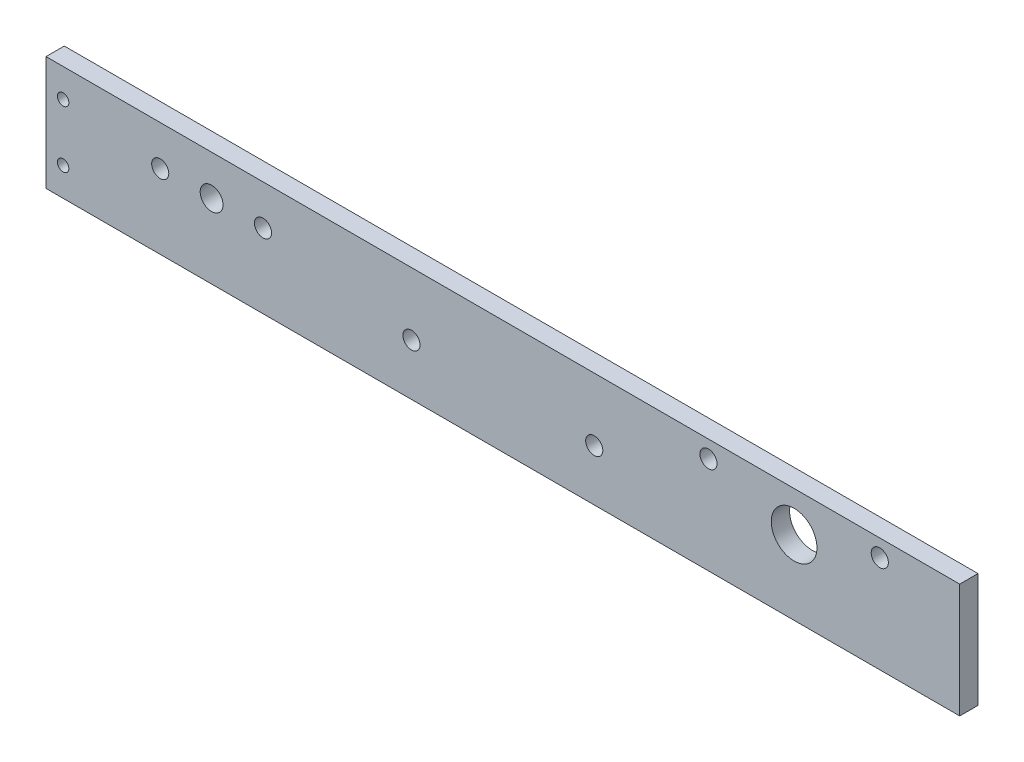
ISO-10303-21;
HEADER;
FILE_DESCRIPTION(('STEP AP214'),'2;1');
FILE_NAME('part.step','',(''),(''),'','','');
FILE_SCHEMA(('AUTOMOTIVE_DESIGN { 1 0 10303 214 1 1 1 1 }'));
ENDSEC;
DATA;
#1=APPLICATION_CONTEXT('core data for automotive mechanical design processes');
#2=APPLICATION_PROTOCOL_DEFINITION('international standard','automotive_design',2000,#1);
#3=PRODUCT_CONTEXT('',#1,'mechanical');
#4=PRODUCT('Part','Part','',(#3));
#5=PRODUCT_RELATED_PRODUCT_CATEGORY('part','',(#4));
#6=PRODUCT_DEFINITION_FORMATION('','',#4);
#7=PRODUCT_DEFINITION_CONTEXT('part definition',#1,'design');
#8=PRODUCT_DEFINITION('design','',#6,#7);
#9=PRODUCT_DEFINITION_SHAPE('','',#8);
#10=(LENGTH_UNIT() NAMED_UNIT(*) SI_UNIT(.MILLI.,.METRE.));
#11=(NAMED_UNIT(*) PLANE_ANGLE_UNIT() SI_UNIT($,.RADIAN.));
#12=(NAMED_UNIT(*) SI_UNIT($,.STERADIAN.) SOLID_ANGLE_UNIT());
#13=UNCERTAINTY_MEASURE_WITH_UNIT(LENGTH_MEASURE(1.E-05),#10,'distance_accuracy_value','');
#14=(GEOMETRIC_REPRESENTATION_CONTEXT(3) GLOBAL_UNCERTAINTY_ASSIGNED_CONTEXT((#13)) GLOBAL_UNIT_ASSIGNED_CONTEXT((#10,
#11,#12)) REPRESENTATION_CONTEXT('',''));
#15=CARTESIAN_POINT('',(0.,0.,0.));
#16=DIRECTION('',(0.,0.,1.));
#17=DIRECTION('',(1.,0.,0.));
#18=AXIS2_PLACEMENT_3D('',#15,#16,#17);
#19=CARTESIAN_POINT('',(0.,0.,6.8));
#20=DIRECTION('',(1.,0.,0.));
#21=DIRECTION('',(0.,0.,-1.));
#22=AXIS2_PLACEMENT_3D('',#19,#20,#21);
#23=PLANE('',#22);
#24=DIRECTION('',(0.,1.,0.));
#25=VECTOR('',#24,1.);
#26=CARTESIAN_POINT('',(0.,0.,10.));
#27=LINE('',#26,#25);
#28=CARTESIAN_POINT('',(0.,-20.,10.));
#29=VERTEX_POINT('',#28);
#30=CARTESIAN_POINT('',(0.,0.,10.));
#31=VERTEX_POINT('',#30);
#32=EDGE_CURVE('E103',#29,#31,#27,.T.);
#33=ORIENTED_EDGE('',*,*,#32,.T.);
#34=DIRECTION('',(0.,0.,1.));
#35=VECTOR('',#34,1.);
#36=CARTESIAN_POINT('',(0.,0.,6.8));
#37=LINE('',#36,#35);
#38=CARTESIAN_POINT('',(0.,0.,6.8));
#39=VERTEX_POINT('',#38);
#40=EDGE_CURVE('E11',#39,#31,#37,.T.);
#41=ORIENTED_EDGE('',*,*,#40,.F.);
#42=DIRECTION('',(0.,1.,0.));
#43=VECTOR('',#42,1.);
#44=CARTESIAN_POINT('',(0.,0.,6.8));
#45=LINE('',#44,#43);
#46=CARTESIAN_POINT('',(0.,-20.,6.8));
#47=VERTEX_POINT('',#46);
#48=EDGE_CURVE('E90',#47,#39,#45,.T.);
#49=ORIENTED_EDGE('',*,*,#48,.F.);
#50=DIRECTION('',(0.,0.,1.));
#51=VECTOR('',#50,1.);
#52=CARTESIAN_POINT('',(0.,-20.,6.8));
#53=LINE('',#52,#51);
#54=EDGE_CURVE('E99',#47,#29,#53,.T.);
#55=ORIENTED_EDGE('',*,*,#54,.T.);
#56=EDGE_LOOP('',(#33,#41,#49,#55));
#57=FACE_BOUND('',#56,.T.);
#58=ADVANCED_FACE('F37',(#57),#23,.F.);
#59=CARTESIAN_POINT('',(0.,0.,6.8));
#60=DIRECTION('',(0.,-1.,0.));
#61=DIRECTION('',(0.,0.,-1.));
#62=AXIS2_PLACEMENT_3D('',#59,#60,#61);
#63=PLANE('',#62);
#64=DIRECTION('',(1.,0.,0.));
#65=VECTOR('',#64,1.);
#66=CARTESIAN_POINT('',(0.,0.,10.));
#67=LINE('',#66,#65);
#68=CARTESIAN_POINT('',(160.,0.,10.));
#69=VERTEX_POINT('',#68);
#70=EDGE_CURVE('E94',#31,#69,#67,.T.);
#71=ORIENTED_EDGE('',*,*,#70,.T.);
#72=DIRECTION('',(0.,0.,1.));
#73=VECTOR('',#72,1.);
#74=CARTESIAN_POINT('',(160.,0.,6.8));
#75=LINE('',#74,#73);
#76=CARTESIAN_POINT('',(160.,0.,6.8));
#77=VERTEX_POINT('',#76);
#78=EDGE_CURVE('E46',#77,#69,#75,.T.);
#79=ORIENTED_EDGE('',*,*,#78,.F.);
#80=DIRECTION('',(1.,0.,0.));
#81=VECTOR('',#80,1.);
#82=CARTESIAN_POINT('',(0.,0.,6.8));
#83=LINE('',#82,#81);
#84=EDGE_CURVE('E85',#39,#77,#83,.T.);
#85=ORIENTED_EDGE('',*,*,#84,.F.);
#86=ORIENTED_EDGE('',*,*,#40,.T.);
#87=EDGE_LOOP('',(#71,#79,#85,#86));
#88=FACE_BOUND('',#87,.T.);
#89=ADVANCED_FACE('F93',(#88),#63,.F.);
#90=CARTESIAN_POINT('',(160.,0.,6.8));
#91=DIRECTION('',(-1.,0.,0.));
#92=DIRECTION('',(0.,0.,1.));
#93=AXIS2_PLACEMENT_3D('',#90,#91,#92);
#94=PLANE('',#93);
#95=DIRECTION('',(0.,-1.,0.));
#96=VECTOR('',#95,1.);
#97=CARTESIAN_POINT('',(160.,0.,10.));
#98=LINE('',#97,#96);
#99=CARTESIAN_POINT('',(160.,-20.,10.));
#100=VERTEX_POINT('',#99);
#101=EDGE_CURVE('E72',#69,#100,#98,.T.);
#102=ORIENTED_EDGE('',*,*,#101,.T.);
#103=DIRECTION('',(0.,0.,1.));
#104=VECTOR('',#103,1.);
#105=CARTESIAN_POINT('',(160.,-20.,6.8));
#106=LINE('',#105,#104);
#107=CARTESIAN_POINT('',(160.,-20.,6.8));
#108=VERTEX_POINT('',#107);
#109=EDGE_CURVE('E95',#108,#100,#106,.T.);
#110=ORIENTED_EDGE('',*,*,#109,.F.);
#111=DIRECTION('',(0.,-1.,0.));
#112=VECTOR('',#111,1.);
#113=CARTESIAN_POINT('',(160.,0.,6.8));
#114=LINE('',#113,#112);
#115=EDGE_CURVE('E88',#77,#108,#114,.T.);
#116=ORIENTED_EDGE('',*,*,#115,.F.);
#117=ORIENTED_EDGE('',*,*,#78,.T.);
#118=EDGE_LOOP('',(#102,#110,#116,#117));
#119=FACE_BOUND('',#118,.T.);
#120=ADVANCED_FACE('F97',(#119),#94,.F.);
#121=CARTESIAN_POINT('',(0.,-20.,6.8));
#122=DIRECTION('',(0.,1.,0.));
#123=DIRECTION('',(0.,0.,1.));
#124=AXIS2_PLACEMENT_3D('',#121,#122,#123);
#125=PLANE('',#124);
#126=DIRECTION('',(-1.,0.,0.));
#127=VECTOR('',#126,1.);
#128=CARTESIAN_POINT('',(0.,-20.,10.));
#129=LINE('',#128,#127);
#130=EDGE_CURVE('E78',#100,#29,#129,.T.);
#131=ORIENTED_EDGE('',*,*,#130,.T.);
#132=ORIENTED_EDGE('',*,*,#54,.F.);
#133=DIRECTION('',(-1.,0.,0.));
#134=VECTOR('',#133,1.);
#135=CARTESIAN_POINT('',(0.,-20.,6.8));
#136=LINE('',#135,#134);
#137=EDGE_CURVE('E55',#108,#47,#136,.T.);
#138=ORIENTED_EDGE('',*,*,#137,.F.);
#139=ORIENTED_EDGE('',*,*,#109,.T.);
#140=EDGE_LOOP('',(#131,#132,#138,#139));
#141=FACE_BOUND('',#140,.T.);
#142=ADVANCED_FACE('F189',(#141),#125,.F.);
#143=CARTESIAN_POINT('',(0.,0.,6.8));
#144=DIRECTION('',(0.,0.,1.));
#145=DIRECTION('',(1.,0.,0.));
#146=AXIS2_PLACEMENT_3D('',#143,#144,#145);
#147=PLANE('',#146);
#148=CARTESIAN_POINT('',(38.,-6.99999999999991,6.8));
#149=DIRECTION('',(0.,0.,1.));
#150=DIRECTION('',(1.,0.,0.));
#151=AXIS2_PLACEMENT_3D('',#148,#149,#150);
#152=CIRCLE('',#151,1.5);
#153=CARTESIAN_POINT('',(39.4999999999999,-6.99999999999991,6.8));
#154=VERTEX_POINT('',#153);
#155=EDGE_CURVE('E138',#154,#154,#152,.T.);
#156=ORIENTED_EDGE('',*,*,#155,.T.);
#157=EDGE_LOOP('',(#156));
#158=FACE_BOUND('',#157,.T.);
#159=CARTESIAN_POINT('',(19.9999999999999,-6.99999999999991,6.8));
#160=DIRECTION('',(0.,0.,1.));
#161=DIRECTION('',(1.,0.,0.));
#162=AXIS2_PLACEMENT_3D('',#159,#160,#161);
#163=CIRCLE('',#162,1.5);
#164=CARTESIAN_POINT('',(21.5,-6.99999999999991,6.8));
#165=VERTEX_POINT('',#164);
#166=EDGE_CURVE('E321',#165,#165,#163,.T.);
#167=ORIENTED_EDGE('',*,*,#166,.T.);
#168=EDGE_LOOP('',(#167));
#169=FACE_BOUND('',#168,.T.);
#170=CARTESIAN_POINT('',(116.,-3.00000000000001,6.8));
#171=DIRECTION('',(0.,0.,-1.));
#172=DIRECTION('',(-1.,0.,0.));
#173=AXIS2_PLACEMENT_3D('',#170,#171,#172);
#174=CIRCLE('',#173,1.5);
#175=CARTESIAN_POINT('',(114.5,-3.00000000000001,6.8));
#176=VERTEX_POINT('',#175);
#177=EDGE_CURVE('E127',#176,#176,#174,.T.);
#178=ORIENTED_EDGE('',*,*,#177,.F.);
#179=EDGE_LOOP('',(#178));
#180=FACE_BOUND('',#179,.T.);
#181=CARTESIAN_POINT('',(146.,-3.00000000000002,6.8));
#182=DIRECTION('',(0.,0.,-1.));
#183=DIRECTION('',(-1.,0.,0.));
#184=AXIS2_PLACEMENT_3D('',#181,#182,#183);
#185=CIRCLE('',#184,1.5);
#186=CARTESIAN_POINT('',(144.5,-3.00000000000002,6.8));
#187=VERTEX_POINT('',#186);
#188=EDGE_CURVE('E133',#187,#187,#185,.T.);
#189=ORIENTED_EDGE('',*,*,#188,.F.);
#190=EDGE_LOOP('',(#189));
#191=FACE_BOUND('',#190,.T.);
#192=CARTESIAN_POINT('',(2.99999999999999,-15.,6.8));
#193=DIRECTION('',(0.,0.,1.));
#194=DIRECTION('',(1.,0.,0.));
#195=AXIS2_PLACEMENT_3D('',#192,#193,#194);
#196=CIRCLE('',#195,1.);
#197=CARTESIAN_POINT('',(3.99999999999999,-15.,6.8));
#198=VERTEX_POINT('',#197);
#199=EDGE_CURVE('E122',#198,#198,#196,.T.);
#200=ORIENTED_EDGE('',*,*,#199,.T.);
#201=EDGE_LOOP('',(#200));
#202=FACE_BOUND('',#201,.T.);
#203=CARTESIAN_POINT('',(3.,-5.,6.8));
#204=DIRECTION('',(0.,0.,1.));
#205=DIRECTION('',(1.,0.,0.));
#206=AXIS2_PLACEMENT_3D('',#203,#204,#205);
#207=CIRCLE('',#206,1.);
#208=CARTESIAN_POINT('',(4.,-5.,6.8));
#209=VERTEX_POINT('',#208);
#210=EDGE_CURVE('E131',#209,#209,#207,.T.);
#211=ORIENTED_EDGE('',*,*,#210,.T.);
#212=EDGE_LOOP('',(#211));
#213=FACE_BOUND('',#212,.T.);
#214=CARTESIAN_POINT('',(96.,-11.,6.8));
#215=DIRECTION('',(0.,0.,1.));
#216=DIRECTION('',(1.,0.,0.));
#217=AXIS2_PLACEMENT_3D('',#214,#215,#216);
#218=CIRCLE('',#217,1.5);
#219=CARTESIAN_POINT('',(97.5,-11.,6.8));
#220=VERTEX_POINT('',#219);
#221=EDGE_CURVE('E155',#220,#220,#218,.T.);
#222=ORIENTED_EDGE('',*,*,#221,.T.);
#223=EDGE_LOOP('',(#222));
#224=FACE_BOUND('',#223,.T.);
#225=CARTESIAN_POINT('',(64.,-11.,6.8));
#226=DIRECTION('',(0.,0.,1.));
#227=DIRECTION('',(1.,0.,0.));
#228=AXIS2_PLACEMENT_3D('',#225,#226,#227);
#229=CIRCLE('',#228,1.5);
#230=CARTESIAN_POINT('',(65.5,-11.,6.8));
#231=VERTEX_POINT('',#230);
#232=EDGE_CURVE('E150',#231,#231,#229,.T.);
#233=ORIENTED_EDGE('',*,*,#232,.T.);
#234=EDGE_LOOP('',(#233));
#235=FACE_BOUND('',#234,.T.);
#236=CARTESIAN_POINT('',(131.,-7.,6.8));
#237=DIRECTION('',(0.,0.,1.));
#238=DIRECTION('',(1.,0.,0.));
#239=AXIS2_PLACEMENT_3D('',#236,#237,#238);
#240=CIRCLE('',#239,3.99999999999999);
#241=CARTESIAN_POINT('',(135.,-7.,6.8));
#242=VERTEX_POINT('',#241);
#243=EDGE_CURVE('E115',#242,#242,#240,.T.);
#244=ORIENTED_EDGE('',*,*,#243,.T.);
#245=EDGE_LOOP('',(#244));
#246=FACE_BOUND('',#245,.T.);
#247=CARTESIAN_POINT('',(29.,-7.,6.8));
#248=DIRECTION('',(0.,0.,1.));
#249=DIRECTION('',(1.,0.,0.));
#250=AXIS2_PLACEMENT_3D('',#247,#248,#249);
#251=CIRCLE('',#250,2.);
#252=CARTESIAN_POINT('',(31.,-7.,6.8));
#253=VERTEX_POINT('',#252);
#254=EDGE_CURVE('E158',#253,#253,#251,.T.);
#255=ORIENTED_EDGE('',*,*,#254,.T.);
#256=EDGE_LOOP('',(#255));
#257=FACE_BOUND('',#256,.T.);
#258=ORIENTED_EDGE('',*,*,#48,.T.);
#259=ORIENTED_EDGE('',*,*,#84,.T.);
#260=ORIENTED_EDGE('',*,*,#115,.T.);
#261=ORIENTED_EDGE('',*,*,#137,.T.);
#262=EDGE_LOOP('',(#258,#259,#260,#261));
#263=FACE_BOUND('',#262,.T.);
#264=ADVANCED_FACE('F86',(#158,#169,#180,#191,#202,#213,#224,#235,#246,#257,#263),#147,.F.);
#265=CARTESIAN_POINT('',(0.,0.,10.));
#266=DIRECTION('',(0.,0.,1.));
#267=DIRECTION('',(1.,0.,0.));
#268=AXIS2_PLACEMENT_3D('',#265,#266,#267);
#269=PLANE('',#268);
#270=CARTESIAN_POINT('',(38.,-6.99999999999991,10.));
#271=DIRECTION('',(0.,0.,1.));
#272=DIRECTION('',(1.,0.,0.));
#273=AXIS2_PLACEMENT_3D('',#270,#271,#272);
#274=CIRCLE('',#273,1.5);
#275=CARTESIAN_POINT('',(39.4999999999999,-6.99999999999991,10.));
#276=VERTEX_POINT('',#275);
#277=EDGE_CURVE('E318',#276,#276,#274,.T.);
#278=ORIENTED_EDGE('',*,*,#277,.F.);
#279=EDGE_LOOP('',(#278));
#280=FACE_BOUND('',#279,.T.);
#281=CARTESIAN_POINT('',(19.9999999999999,-6.99999999999991,10.));
#282=DIRECTION('',(0.,0.,1.));
#283=DIRECTION('',(1.,0.,0.));
#284=AXIS2_PLACEMENT_3D('',#281,#282,#283);
#285=CIRCLE('',#284,1.5);
#286=CARTESIAN_POINT('',(21.5,-6.99999999999991,10.));
#287=VERTEX_POINT('',#286);
#288=EDGE_CURVE('E325',#287,#287,#285,.T.);
#289=ORIENTED_EDGE('',*,*,#288,.F.);
#290=EDGE_LOOP('',(#289));
#291=FACE_BOUND('',#290,.T.);
#292=CARTESIAN_POINT('',(116.,-3.00000000000001,10.));
#293=DIRECTION('',(0.,0.,1.));
#294=DIRECTION('',(1.,0.,0.));
#295=AXIS2_PLACEMENT_3D('',#292,#293,#294);
#296=CIRCLE('',#295,1.5);
#297=CARTESIAN_POINT('',(117.5,-3.00000000000001,10.));
#298=VERTEX_POINT('',#297);
#299=EDGE_CURVE('E40',#298,#298,#296,.T.);
#300=ORIENTED_EDGE('',*,*,#299,.F.);
#301=EDGE_LOOP('',(#300));
#302=FACE_BOUND('',#301,.T.);
#303=CARTESIAN_POINT('',(146.,-3.00000000000002,10.));
#304=DIRECTION('',(0.,0.,1.));
#305=DIRECTION('',(1.,0.,0.));
#306=AXIS2_PLACEMENT_3D('',#303,#304,#305);
#307=CIRCLE('',#306,1.5);
#308=CARTESIAN_POINT('',(147.5,-3.00000000000002,10.));
#309=VERTEX_POINT('',#308);
#310=EDGE_CURVE('E125',#309,#309,#307,.T.);
#311=ORIENTED_EDGE('',*,*,#310,.F.);
#312=EDGE_LOOP('',(#311));
#313=FACE_BOUND('',#312,.T.);
#314=CARTESIAN_POINT('',(2.99999999999999,-15.,10.));
#315=DIRECTION('',(0.,0.,1.));
#316=DIRECTION('',(1.,0.,0.));
#317=AXIS2_PLACEMENT_3D('',#314,#315,#316);
#318=CIRCLE('',#317,1.);
#319=CARTESIAN_POINT('',(3.99999999999999,-15.,10.));
#320=VERTEX_POINT('',#319);
#321=EDGE_CURVE('E121',#320,#320,#318,.T.);
#322=ORIENTED_EDGE('',*,*,#321,.F.);
#323=EDGE_LOOP('',(#322));
#324=FACE_BOUND('',#323,.T.);
#325=CARTESIAN_POINT('',(3.,-5.,10.));
#326=DIRECTION('',(0.,0.,1.));
#327=DIRECTION('',(1.,0.,0.));
#328=AXIS2_PLACEMENT_3D('',#325,#326,#327);
#329=CIRCLE('',#328,1.);
#330=CARTESIAN_POINT('',(4.,-5.,10.));
#331=VERTEX_POINT('',#330);
#332=EDGE_CURVE('E118',#331,#331,#329,.T.);
#333=ORIENTED_EDGE('',*,*,#332,.F.);
#334=EDGE_LOOP('',(#333));
#335=FACE_BOUND('',#334,.T.);
#336=CARTESIAN_POINT('',(96.,-11.,10.));
#337=DIRECTION('',(0.,0.,1.));
#338=DIRECTION('',(1.,0.,0.));
#339=AXIS2_PLACEMENT_3D('',#336,#337,#338);
#340=CIRCLE('',#339,1.5);
#341=CARTESIAN_POINT('',(97.5,-11.,10.));
#342=VERTEX_POINT('',#341);
#343=EDGE_CURVE('E147',#342,#342,#340,.T.);
#344=ORIENTED_EDGE('',*,*,#343,.F.);
#345=EDGE_LOOP('',(#344));
#346=FACE_BOUND('',#345,.T.);
#347=CARTESIAN_POINT('',(64.,-11.,10.));
#348=DIRECTION('',(0.,0.,1.));
#349=DIRECTION('',(1.,0.,0.));
#350=AXIS2_PLACEMENT_3D('',#347,#348,#349);
#351=CIRCLE('',#350,1.5);
#352=CARTESIAN_POINT('',(65.5,-11.,10.));
#353=VERTEX_POINT('',#352);
#354=EDGE_CURVE('E124',#353,#353,#351,.T.);
#355=ORIENTED_EDGE('',*,*,#354,.F.);
#356=EDGE_LOOP('',(#355));
#357=FACE_BOUND('',#356,.T.);
#358=CARTESIAN_POINT('',(131.,-7.,10.));
#359=DIRECTION('',(0.,0.,1.));
#360=DIRECTION('',(1.,0.,0.));
#361=AXIS2_PLACEMENT_3D('',#358,#359,#360);
#362=CIRCLE('',#361,3.99999999999999);
#363=CARTESIAN_POINT('',(135.,-7.,10.));
#364=VERTEX_POINT('',#363);
#365=EDGE_CURVE('E106',#364,#364,#362,.T.);
#366=ORIENTED_EDGE('',*,*,#365,.F.);
#367=EDGE_LOOP('',(#366));
#368=FACE_BOUND('',#367,.T.);
#369=CARTESIAN_POINT('',(29.,-7.,10.));
#370=DIRECTION('',(0.,0.,1.));
#371=DIRECTION('',(1.,0.,0.));
#372=AXIS2_PLACEMENT_3D('',#369,#370,#371);
#373=CIRCLE('',#372,2.);
#374=CARTESIAN_POINT('',(31.,-7.,10.));
#375=VERTEX_POINT('',#374);
#376=EDGE_CURVE('E112',#375,#375,#373,.T.);
#377=ORIENTED_EDGE('',*,*,#376,.F.);
#378=EDGE_LOOP('',(#377));
#379=FACE_BOUND('',#378,.T.);
#380=ORIENTED_EDGE('',*,*,#32,.F.);
#381=ORIENTED_EDGE('',*,*,#130,.F.);
#382=ORIENTED_EDGE('',*,*,#101,.F.);
#383=ORIENTED_EDGE('',*,*,#70,.F.);
#384=EDGE_LOOP('',(#380,#381,#382,#383));
#385=FACE_BOUND('',#384,.T.);
#386=ADVANCED_FACE('F168',(#280,#291,#302,#313,#324,#335,#346,#357,#368,#379,#385),#269,.T.);
#387=CARTESIAN_POINT('',(29.,-7.,6.8));
#388=DIRECTION('',(0.,0.,1.));
#389=DIRECTION('',(1.,0.,0.));
#390=AXIS2_PLACEMENT_3D('',#387,#388,#389);
#391=CYLINDRICAL_SURFACE('',#390,2.);
#392=CARTESIAN_POINT('',(31.,-7.,10.));
#393=CARTESIAN_POINT('',(31.,-7.,9.96666666666667));
#394=CARTESIAN_POINT('',(31.,-7.,9.93333333333333));
#395=CARTESIAN_POINT('',(31.,-7.,9.86666666666667));
#396=CARTESIAN_POINT('',(31.,-7.,9.83333333333333));
#397=CARTESIAN_POINT('',(31.,-7.,9.76666666666667));
#398=CARTESIAN_POINT('',(31.,-7.,9.73333333333333));
#399=CARTESIAN_POINT('',(31.,-7.,9.66666666666667));
#400=CARTESIAN_POINT('',(31.,-7.,9.63333333333333));
#401=CARTESIAN_POINT('',(31.,-7.,9.56666666666667));
#402=CARTESIAN_POINT('',(31.,-7.,9.53333333333333));
#403=CARTESIAN_POINT('',(31.,-7.,9.46666666666667));
#404=CARTESIAN_POINT('',(31.,-7.,9.43333333333333));
#405=CARTESIAN_POINT('',(31.,-7.,9.36666666666667));
#406=CARTESIAN_POINT('',(31.,-7.,9.33333333333333));
#407=CARTESIAN_POINT('',(31.,-7.,9.26666666666667));
#408=CARTESIAN_POINT('',(31.,-7.,9.23333333333333));
#409=CARTESIAN_POINT('',(31.,-7.,9.16666666666667));
#410=CARTESIAN_POINT('',(31.,-7.,9.13333333333333));
#411=CARTESIAN_POINT('',(31.,-7.,9.06666666666667));
#412=CARTESIAN_POINT('',(31.,-7.,9.03333333333333));
#413=CARTESIAN_POINT('',(31.,-7.,8.96666666666667));
#414=CARTESIAN_POINT('',(31.,-7.,8.93333333333333));
#415=CARTESIAN_POINT('',(31.,-7.,8.86666666666667));
#416=CARTESIAN_POINT('',(31.,-7.,8.83333333333333));
#417=CARTESIAN_POINT('',(31.,-7.,8.76666666666667));
#418=CARTESIAN_POINT('',(31.,-7.,8.73333333333333));
#419=CARTESIAN_POINT('',(31.,-7.,8.66666666666667));
#420=CARTESIAN_POINT('',(31.,-7.,8.63333333333333));
#421=CARTESIAN_POINT('',(31.,-7.,8.56666666666667));
#422=CARTESIAN_POINT('',(31.,-7.,8.53333333333333));
#423=CARTESIAN_POINT('',(31.,-7.,8.46666666666667));
#424=CARTESIAN_POINT('',(31.,-7.,8.43333333333333));
#425=CARTESIAN_POINT('',(31.,-7.,8.36666666666667));
#426=CARTESIAN_POINT('',(31.,-7.,8.33333333333333));
#427=CARTESIAN_POINT('',(31.,-7.,8.26666666666667));
#428=CARTESIAN_POINT('',(31.,-7.,8.23333333333333));
#429=CARTESIAN_POINT('',(31.,-7.,8.16666666666667));
#430=CARTESIAN_POINT('',(31.,-7.,8.13333333333333));
#431=CARTESIAN_POINT('',(31.,-7.,8.06666666666667));
#432=CARTESIAN_POINT('',(31.,-7.,8.03333333333333));
#433=CARTESIAN_POINT('',(31.,-7.,7.96666666666667));
#434=CARTESIAN_POINT('',(31.,-7.,7.93333333333333));
#435=CARTESIAN_POINT('',(31.,-7.,7.86666666666667));
#436=CARTESIAN_POINT('',(31.,-7.,7.83333333333333));
#437=CARTESIAN_POINT('',(31.,-7.,7.76666666666667));
#438=CARTESIAN_POINT('',(31.,-7.,7.73333333333333));
#439=CARTESIAN_POINT('',(31.,-7.,7.66666666666667));
#440=CARTESIAN_POINT('',(31.,-7.,7.63333333333333));
#441=CARTESIAN_POINT('',(31.,-7.,7.56666666666667));
#442=CARTESIAN_POINT('',(31.,-7.,7.53333333333333));
#443=CARTESIAN_POINT('',(31.,-7.,7.46666666666667));
#444=CARTESIAN_POINT('',(31.,-7.,7.43333333333333));
#445=CARTESIAN_POINT('',(31.,-7.,7.36666666666667));
#446=CARTESIAN_POINT('',(31.,-7.,7.33333333333333));
#447=CARTESIAN_POINT('',(31.,-7.,7.26666666666667));
#448=CARTESIAN_POINT('',(31.,-7.,7.23333333333333));
#449=CARTESIAN_POINT('',(31.,-7.,7.16666666666667));
#450=CARTESIAN_POINT('',(31.,-7.,7.13333333333333));
#451=CARTESIAN_POINT('',(31.,-7.,7.06666666666667));
#452=CARTESIAN_POINT('',(31.,-7.,7.03333333333333));
#453=CARTESIAN_POINT('',(31.,-7.,6.96666666666667));
#454=CARTESIAN_POINT('',(31.,-7.,6.93333333333333));
#455=CARTESIAN_POINT('',(31.,-7.,6.86666666666667));
#456=CARTESIAN_POINT('',(31.,-7.,6.83333333333333));
#457=CARTESIAN_POINT('',(31.,-7.,6.8));
#458=B_SPLINE_CURVE_WITH_KNOTS('',3,(#392,#393,#394,#395,#396,#397,#398,#399,#400,#401,#402,
#403,#404,#405,#406,#407,#408,#409,#410,#411,#412,#413,#414,#415,#416,#417,#418,#419,#420,#421,
#422,#423,#424,#425,#426,#427,#428,#429,#430,#431,#432,#433,#434,#435,#436,#437,#438,#439,#440,
#441,#442,#443,#444,#445,#446,#447,#448,#449,#450,#451,#452,#453,#454,#455,#456,#457),
.UNSPECIFIED.,.F.,.F.,(4,2,2,2,2,2,2,2,2,2,2,2,2,2,2,2,2,2,2,2,2,2,2,2,2,2,2,2,2,2,2,2,4),(0.,
0.100000000000001,0.200000000000001,0.3,0.400000000000001,0.5,0.6,0.700000000000001,0.8,0.9,1.,
1.1,1.2,1.3,1.4,1.5,1.6,1.7,1.8,1.9,2.,2.1,2.2,2.3,2.4,2.5,2.6,2.7,2.8,2.9,3.,3.1,3.2),.UNSPECIFIED.);
#459=EDGE_CURVE('BSEAM165',#375,#253,#458,.T.);
#460=ORIENTED_EDGE('',*,*,#376,.T.);
#461=ORIENTED_EDGE('',*,*,#254,.F.);
#462=ORIENTED_EDGE('',*,*,#459,.T.);
#463=ORIENTED_EDGE('',*,*,#459,.F.);
#464=EDGE_LOOP('',(#460,#462,#461,#463));
#465=FACE_BOUND('',#464,.T.);
#466=ADVANCED_FACE('F165',(#465),#391,.F.);
#467=CARTESIAN_POINT('',(131.,-7.,6.8));
#468=DIRECTION('',(0.,0.,1.));
#469=DIRECTION('',(1.,0.,0.));
#470=AXIS2_PLACEMENT_3D('',#467,#468,#469);
#471=CYLINDRICAL_SURFACE('',#470,3.99999999999999);
#472=CARTESIAN_POINT('',(135.,-7.,10.));
#473=CARTESIAN_POINT('',(135.,-7.,9.96666666666667));
#474=CARTESIAN_POINT('',(135.,-7.,9.93333333333333));
#475=CARTESIAN_POINT('',(135.,-7.,9.86666666666667));
#476=CARTESIAN_POINT('',(135.,-7.,9.83333333333333));
#477=CARTESIAN_POINT('',(135.,-7.,9.76666666666667));
#478=CARTESIAN_POINT('',(135.,-7.,9.73333333333333));
#479=CARTESIAN_POINT('',(135.,-7.,9.66666666666667));
#480=CARTESIAN_POINT('',(135.,-7.,9.63333333333333));
#481=CARTESIAN_POINT('',(135.,-7.,9.56666666666667));
#482=CARTESIAN_POINT('',(135.,-7.,9.53333333333333));
#483=CARTESIAN_POINT('',(135.,-7.,9.46666666666667));
#484=CARTESIAN_POINT('',(135.,-7.,9.43333333333333));
#485=CARTESIAN_POINT('',(135.,-7.,9.36666666666667));
#486=CARTESIAN_POINT('',(135.,-7.,9.33333333333333));
#487=CARTESIAN_POINT('',(135.,-7.,9.26666666666667));
#488=CARTESIAN_POINT('',(135.,-7.,9.23333333333333));
#489=CARTESIAN_POINT('',(135.,-7.,9.16666666666667));
#490=CARTESIAN_POINT('',(135.,-7.,9.13333333333333));
#491=CARTESIAN_POINT('',(135.,-7.,9.06666666666667));
#492=CARTESIAN_POINT('',(135.,-7.,9.03333333333333));
#493=CARTESIAN_POINT('',(135.,-7.,8.96666666666667));
#494=CARTESIAN_POINT('',(135.,-7.,8.93333333333333));
#495=CARTESIAN_POINT('',(135.,-7.,8.86666666666667));
#496=CARTESIAN_POINT('',(135.,-7.,8.83333333333333));
#497=CARTESIAN_POINT('',(135.,-7.,8.76666666666667));
#498=CARTESIAN_POINT('',(135.,-7.,8.73333333333333));
#499=CARTESIAN_POINT('',(135.,-7.,8.66666666666667));
#500=CARTESIAN_POINT('',(135.,-7.,8.63333333333333));
#501=CARTESIAN_POINT('',(135.,-7.,8.56666666666667));
#502=CARTESIAN_POINT('',(135.,-7.,8.53333333333333));
#503=CARTESIAN_POINT('',(135.,-7.,8.46666666666667));
#504=CARTESIAN_POINT('',(135.,-7.,8.43333333333333));
#505=CARTESIAN_POINT('',(135.,-7.,8.36666666666667));
#506=CARTESIAN_POINT('',(135.,-7.,8.33333333333333));
#507=CARTESIAN_POINT('',(135.,-7.,8.26666666666667));
#508=CARTESIAN_POINT('',(135.,-7.,8.23333333333333));
#509=CARTESIAN_POINT('',(135.,-7.,8.16666666666667));
#510=CARTESIAN_POINT('',(135.,-7.,8.13333333333333));
#511=CARTESIAN_POINT('',(135.,-7.,8.06666666666667));
#512=CARTESIAN_POINT('',(135.,-7.,8.03333333333333));
#513=CARTESIAN_POINT('',(135.,-7.,7.96666666666667));
#514=CARTESIAN_POINT('',(135.,-7.,7.93333333333333));
#515=CARTESIAN_POINT('',(135.,-7.,7.86666666666667));
#516=CARTESIAN_POINT('',(135.,-7.,7.83333333333333));
#517=CARTESIAN_POINT('',(135.,-7.,7.76666666666667));
#518=CARTESIAN_POINT('',(135.,-7.,7.73333333333333));
#519=CARTESIAN_POINT('',(135.,-7.,7.66666666666667));
#520=CARTESIAN_POINT('',(135.,-7.,7.63333333333333));
#521=CARTESIAN_POINT('',(135.,-7.,7.56666666666667));
#522=CARTESIAN_POINT('',(135.,-7.,7.53333333333333));
#523=CARTESIAN_POINT('',(135.,-7.,7.46666666666667));
#524=CARTESIAN_POINT('',(135.,-7.,7.43333333333333));
#525=CARTESIAN_POINT('',(135.,-7.,7.36666666666667));
#526=CARTESIAN_POINT('',(135.,-7.,7.33333333333333));
#527=CARTESIAN_POINT('',(135.,-7.,7.26666666666667));
#528=CARTESIAN_POINT('',(135.,-7.,7.23333333333333));
#529=CARTESIAN_POINT('',(135.,-7.,7.16666666666667));
#530=CARTESIAN_POINT('',(135.,-7.,7.13333333333333));
#531=CARTESIAN_POINT('',(135.,-7.,7.06666666666667));
#532=CARTESIAN_POINT('',(135.,-7.,7.03333333333333));
#533=CARTESIAN_POINT('',(135.,-7.,6.96666666666667));
#534=CARTESIAN_POINT('',(135.,-7.,6.93333333333333));
#535=CARTESIAN_POINT('',(135.,-7.,6.86666666666667));
#536=CARTESIAN_POINT('',(135.,-7.,6.83333333333333));
#537=CARTESIAN_POINT('',(135.,-7.,6.8));
#538=B_SPLINE_CURVE_WITH_KNOTS('',3,(#472,#473,#474,#475,#476,#477,#478,#479,#480,#481,#482,
#483,#484,#485,#486,#487,#488,#489,#490,#491,#492,#493,#494,#495,#496,#497,#498,#499,#500,#501,
#502,#503,#504,#505,#506,#507,#508,#509,#510,#511,#512,#513,#514,#515,#516,#517,#518,#519,#520,
#521,#522,#523,#524,#525,#526,#527,#528,#529,#530,#531,#532,#533,#534,#535,#536,#537),
.UNSPECIFIED.,.F.,.F.,(4,2,2,2,2,2,2,2,2,2,2,2,2,2,2,2,2,2,2,2,2,2,2,2,2,2,2,2,2,2,2,2,4),(0.,
0.100000000000001,0.200000000000001,0.3,0.400000000000001,0.5,0.6,0.700000000000001,0.8,0.9,1.,
1.1,1.2,1.3,1.4,1.5,1.6,1.7,1.8,1.9,2.,2.1,2.2,2.3,2.4,2.5,2.6,2.7,2.8,2.9,3.,3.1,3.2),.UNSPECIFIED.);
#539=EDGE_CURVE('BSEAM167',#364,#242,#538,.T.);
#540=ORIENTED_EDGE('',*,*,#365,.T.);
#541=ORIENTED_EDGE('',*,*,#243,.F.);
#542=ORIENTED_EDGE('',*,*,#539,.T.);
#543=ORIENTED_EDGE('',*,*,#539,.F.);
#544=EDGE_LOOP('',(#540,#542,#541,#543));
#545=FACE_BOUND('',#544,.T.);
#546=ADVANCED_FACE('F167',(#545),#471,.F.);
#547=CARTESIAN_POINT('',(64.,-11.,0.));
#548=DIRECTION('',(0.,0.,1.));
#549=DIRECTION('',(1.,0.,0.));
#550=AXIS2_PLACEMENT_3D('',#547,#548,#549);
#551=CYLINDRICAL_SURFACE('',#550,1.5);
#552=ORIENTED_EDGE('',*,*,#354,.T.);
#553=EDGE_LOOP('',(#552));
#554=FACE_BOUND('',#553,.T.);
#555=ORIENTED_EDGE('',*,*,#232,.F.);
#556=EDGE_LOOP('',(#555));
#557=FACE_BOUND('',#556,.T.);
#558=ADVANCED_FACE('F175',(#554,#557),#551,.F.);
#559=CARTESIAN_POINT('',(96.,-11.,0.));
#560=DIRECTION('',(0.,0.,1.));
#561=DIRECTION('',(1.,0.,0.));
#562=AXIS2_PLACEMENT_3D('',#559,#560,#561);
#563=CYLINDRICAL_SURFACE('',#562,1.5);
#564=ORIENTED_EDGE('',*,*,#343,.T.);
#565=EDGE_LOOP('',(#564));
#566=FACE_BOUND('',#565,.T.);
#567=ORIENTED_EDGE('',*,*,#221,.F.);
#568=EDGE_LOOP('',(#567));
#569=FACE_BOUND('',#568,.T.);
#570=ADVANCED_FACE('F242',(#566,#569),#563,.F.);
#571=CARTESIAN_POINT('',(3.,-5.,6.8));
#572=DIRECTION('',(0.,0.,1.));
#573=DIRECTION('',(1.,0.,0.));
#574=AXIS2_PLACEMENT_3D('',#571,#572,#573);
#575=CYLINDRICAL_SURFACE('',#574,1.);
#576=CARTESIAN_POINT('',(4.,-5.,10.));
#577=CARTESIAN_POINT('',(4.,-5.,9.96666666666667));
#578=CARTESIAN_POINT('',(4.,-5.,9.93333333333333));
#579=CARTESIAN_POINT('',(4.,-5.,9.86666666666667));
#580=CARTESIAN_POINT('',(4.,-5.,9.83333333333333));
#581=CARTESIAN_POINT('',(4.,-5.,9.76666666666667));
#582=CARTESIAN_POINT('',(4.,-5.,9.73333333333333));
#583=CARTESIAN_POINT('',(4.,-5.,9.66666666666667));
#584=CARTESIAN_POINT('',(4.,-5.,9.63333333333333));
#585=CARTESIAN_POINT('',(4.,-5.,9.56666666666667));
#586=CARTESIAN_POINT('',(4.,-5.,9.53333333333333));
#587=CARTESIAN_POINT('',(4.,-5.,9.46666666666667));
#588=CARTESIAN_POINT('',(4.,-5.,9.43333333333333));
#589=CARTESIAN_POINT('',(4.,-5.,9.36666666666667));
#590=CARTESIAN_POINT('',(4.,-5.,9.33333333333333));
#591=CARTESIAN_POINT('',(4.,-5.,9.26666666666667));
#592=CARTESIAN_POINT('',(4.,-5.,9.23333333333333));
#593=CARTESIAN_POINT('',(4.,-5.,9.16666666666667));
#594=CARTESIAN_POINT('',(4.,-5.,9.13333333333333));
#595=CARTESIAN_POINT('',(4.,-5.,9.06666666666667));
#596=CARTESIAN_POINT('',(4.,-5.,9.03333333333333));
#597=CARTESIAN_POINT('',(4.,-5.,8.96666666666667));
#598=CARTESIAN_POINT('',(4.,-5.,8.93333333333333));
#599=CARTESIAN_POINT('',(4.,-5.,8.86666666666667));
#600=CARTESIAN_POINT('',(4.,-5.,8.83333333333333));
#601=CARTESIAN_POINT('',(4.,-5.,8.76666666666667));
#602=CARTESIAN_POINT('',(4.,-5.,8.73333333333333));
#603=CARTESIAN_POINT('',(4.,-5.,8.66666666666667));
#604=CARTESIAN_POINT('',(4.,-5.,8.63333333333333));
#605=CARTESIAN_POINT('',(4.,-5.,8.56666666666667));
#606=CARTESIAN_POINT('',(4.,-5.,8.53333333333333));
#607=CARTESIAN_POINT('',(4.,-5.,8.46666666666667));
#608=CARTESIAN_POINT('',(4.,-5.,8.43333333333333));
#609=CARTESIAN_POINT('',(4.,-5.,8.36666666666667));
#610=CARTESIAN_POINT('',(4.,-5.,8.33333333333333));
#611=CARTESIAN_POINT('',(4.,-5.,8.26666666666667));
#612=CARTESIAN_POINT('',(4.,-5.,8.23333333333333));
#613=CARTESIAN_POINT('',(4.,-5.,8.16666666666667));
#614=CARTESIAN_POINT('',(4.,-5.,8.13333333333333));
#615=CARTESIAN_POINT('',(4.,-5.,8.06666666666667));
#616=CARTESIAN_POINT('',(4.,-5.,8.03333333333333));
#617=CARTESIAN_POINT('',(4.,-5.,7.96666666666667));
#618=CARTESIAN_POINT('',(4.,-5.,7.93333333333333));
#619=CARTESIAN_POINT('',(4.,-5.,7.86666666666667));
#620=CARTESIAN_POINT('',(4.,-5.,7.83333333333333));
#621=CARTESIAN_POINT('',(4.,-5.,7.76666666666667));
#622=CARTESIAN_POINT('',(4.,-5.,7.73333333333333));
#623=CARTESIAN_POINT('',(4.,-5.,7.66666666666667));
#624=CARTESIAN_POINT('',(4.,-5.,7.63333333333333));
#625=CARTESIAN_POINT('',(4.,-5.,7.56666666666667));
#626=CARTESIAN_POINT('',(4.,-5.,7.53333333333333));
#627=CARTESIAN_POINT('',(4.,-5.,7.46666666666667));
#628=CARTESIAN_POINT('',(4.,-5.,7.43333333333333));
#629=CARTESIAN_POINT('',(4.,-5.,7.36666666666667));
#630=CARTESIAN_POINT('',(4.,-5.,7.33333333333333));
#631=CARTESIAN_POINT('',(4.,-5.,7.26666666666667));
#632=CARTESIAN_POINT('',(4.,-5.,7.23333333333333));
#633=CARTESIAN_POINT('',(4.,-5.,7.16666666666667));
#634=CARTESIAN_POINT('',(4.,-5.,7.13333333333333));
#635=CARTESIAN_POINT('',(4.,-5.,7.06666666666667));
#636=CARTESIAN_POINT('',(4.,-5.,7.03333333333333));
#637=CARTESIAN_POINT('',(4.,-5.,6.96666666666667));
#638=CARTESIAN_POINT('',(4.,-5.,6.93333333333333));
#639=CARTESIAN_POINT('',(4.,-5.,6.86666666666667));
#640=CARTESIAN_POINT('',(4.,-5.,6.83333333333333));
#641=CARTESIAN_POINT('',(4.,-5.,6.8));
#642=B_SPLINE_CURVE_WITH_KNOTS('',3,(#576,#577,#578,#579,#580,#581,#582,#583,#584,#585,#586,
#587,#588,#589,#590,#591,#592,#593,#594,#595,#596,#597,#598,#599,#600,#601,#602,#603,#604,#605,
#606,#607,#608,#609,#610,#611,#612,#613,#614,#615,#616,#617,#618,#619,#620,#621,#622,#623,#624,
#625,#626,#627,#628,#629,#630,#631,#632,#633,#634,#635,#636,#637,#638,#639,#640,#641),
.UNSPECIFIED.,.F.,.F.,(4,2,2,2,2,2,2,2,2,2,2,2,2,2,2,2,2,2,2,2,2,2,2,2,2,2,2,2,2,2,2,2,4),(0.,
0.100000000000001,0.200000000000001,0.3,0.400000000000001,0.5,0.6,0.700000000000001,0.8,0.9,1.,
1.1,1.2,1.3,1.4,1.5,1.6,1.7,1.8,1.9,2.,2.1,2.2,2.3,2.4,2.5,2.6,2.7,2.8,2.9,3.,3.1,3.2),.UNSPECIFIED.);
#643=EDGE_CURVE('BSEAM251',#331,#209,#642,.T.);
#644=ORIENTED_EDGE('',*,*,#332,.T.);
#645=ORIENTED_EDGE('',*,*,#210,.F.);
#646=ORIENTED_EDGE('',*,*,#643,.T.);
#647=ORIENTED_EDGE('',*,*,#643,.F.);
#648=EDGE_LOOP('',(#644,#646,#645,#647));
#649=FACE_BOUND('',#648,.T.);
#650=ADVANCED_FACE('F251',(#649),#575,.F.);
#651=CARTESIAN_POINT('',(2.99999999999999,-15.,6.8));
#652=DIRECTION('',(0.,0.,1.));
#653=DIRECTION('',(1.,0.,0.));
#654=AXIS2_PLACEMENT_3D('',#651,#652,#653);
#655=CYLINDRICAL_SURFACE('',#654,1.);
#656=CARTESIAN_POINT('',(3.99999999999999,-15.,10.));
#657=CARTESIAN_POINT('',(3.99999999999999,-15.,9.96666666666667));
#658=CARTESIAN_POINT('',(3.99999999999999,-15.,9.93333333333333));
#659=CARTESIAN_POINT('',(3.99999999999999,-15.,9.86666666666667));
#660=CARTESIAN_POINT('',(3.99999999999999,-15.,9.83333333333333));
#661=CARTESIAN_POINT('',(3.99999999999999,-15.,9.76666666666667));
#662=CARTESIAN_POINT('',(3.99999999999999,-15.,9.73333333333333));
#663=CARTESIAN_POINT('',(3.99999999999999,-15.,9.66666666666667));
#664=CARTESIAN_POINT('',(3.99999999999999,-15.,9.63333333333333));
#665=CARTESIAN_POINT('',(3.99999999999999,-15.,9.56666666666667));
#666=CARTESIAN_POINT('',(3.99999999999999,-15.,9.53333333333333));
#667=CARTESIAN_POINT('',(3.99999999999999,-15.,9.46666666666667));
#668=CARTESIAN_POINT('',(3.99999999999999,-15.,9.43333333333333));
#669=CARTESIAN_POINT('',(3.99999999999999,-15.,9.36666666666667));
#670=CARTESIAN_POINT('',(3.99999999999999,-15.,9.33333333333333));
#671=CARTESIAN_POINT('',(3.99999999999999,-15.,9.26666666666667));
#672=CARTESIAN_POINT('',(3.99999999999999,-15.,9.23333333333333));
#673=CARTESIAN_POINT('',(3.99999999999999,-15.,9.16666666666667));
#674=CARTESIAN_POINT('',(3.99999999999999,-15.,9.13333333333333));
#675=CARTESIAN_POINT('',(3.99999999999999,-15.,9.06666666666667));
#676=CARTESIAN_POINT('',(3.99999999999999,-15.,9.03333333333333));
#677=CARTESIAN_POINT('',(3.99999999999999,-15.,8.96666666666667));
#678=CARTESIAN_POINT('',(3.99999999999999,-15.,8.93333333333333));
#679=CARTESIAN_POINT('',(3.99999999999999,-15.,8.86666666666667));
#680=CARTESIAN_POINT('',(3.99999999999999,-15.,8.83333333333333));
#681=CARTESIAN_POINT('',(3.99999999999999,-15.,8.76666666666667));
#682=CARTESIAN_POINT('',(3.99999999999999,-15.,8.73333333333333));
#683=CARTESIAN_POINT('',(3.99999999999999,-15.,8.66666666666667));
#684=CARTESIAN_POINT('',(3.99999999999999,-15.,8.63333333333333));
#685=CARTESIAN_POINT('',(3.99999999999999,-15.,8.56666666666667));
#686=CARTESIAN_POINT('',(3.99999999999999,-15.,8.53333333333333));
#687=CARTESIAN_POINT('',(3.99999999999999,-15.,8.46666666666667));
#688=CARTESIAN_POINT('',(3.99999999999999,-15.,8.43333333333333));
#689=CARTESIAN_POINT('',(3.99999999999999,-15.,8.36666666666667));
#690=CARTESIAN_POINT('',(3.99999999999999,-15.,8.33333333333333));
#691=CARTESIAN_POINT('',(3.99999999999999,-15.,8.26666666666667));
#692=CARTESIAN_POINT('',(3.99999999999999,-15.,8.23333333333333));
#693=CARTESIAN_POINT('',(3.99999999999999,-15.,8.16666666666667));
#694=CARTESIAN_POINT('',(3.99999999999999,-15.,8.13333333333333));
#695=CARTESIAN_POINT('',(3.99999999999999,-15.,8.06666666666667));
#696=CARTESIAN_POINT('',(3.99999999999999,-15.,8.03333333333333));
#697=CARTESIAN_POINT('',(3.99999999999999,-15.,7.96666666666667));
#698=CARTESIAN_POINT('',(3.99999999999999,-15.,7.93333333333333));
#699=CARTESIAN_POINT('',(3.99999999999999,-15.,7.86666666666667));
#700=CARTESIAN_POINT('',(3.99999999999999,-15.,7.83333333333333));
#701=CARTESIAN_POINT('',(3.99999999999999,-15.,7.76666666666667));
#702=CARTESIAN_POINT('',(3.99999999999999,-15.,7.73333333333333));
#703=CARTESIAN_POINT('',(3.99999999999999,-15.,7.66666666666667));
#704=CARTESIAN_POINT('',(3.99999999999999,-15.,7.63333333333333));
#705=CARTESIAN_POINT('',(3.99999999999999,-15.,7.56666666666667));
#706=CARTESIAN_POINT('',(3.99999999999999,-15.,7.53333333333333));
#707=CARTESIAN_POINT('',(3.99999999999999,-15.,7.46666666666667));
#708=CARTESIAN_POINT('',(3.99999999999999,-15.,7.43333333333333));
#709=CARTESIAN_POINT('',(3.99999999999999,-15.,7.36666666666667));
#710=CARTESIAN_POINT('',(3.99999999999999,-15.,7.33333333333333));
#711=CARTESIAN_POINT('',(3.99999999999999,-15.,7.26666666666667));
#712=CARTESIAN_POINT('',(3.99999999999999,-15.,7.23333333333333));
#713=CARTESIAN_POINT('',(3.99999999999999,-15.,7.16666666666667));
#714=CARTESIAN_POINT('',(3.99999999999999,-15.,7.13333333333333));
#715=CARTESIAN_POINT('',(3.99999999999999,-15.,7.06666666666667));
#716=CARTESIAN_POINT('',(3.99999999999999,-15.,7.03333333333333));
#717=CARTESIAN_POINT('',(3.99999999999999,-15.,6.96666666666667));
#718=CARTESIAN_POINT('',(3.99999999999999,-15.,6.93333333333333));
#719=CARTESIAN_POINT('',(3.99999999999999,-15.,6.86666666666667));
#720=CARTESIAN_POINT('',(3.99999999999999,-15.,6.83333333333333));
#721=CARTESIAN_POINT('',(3.99999999999999,-15.,6.8));
#722=B_SPLINE_CURVE_WITH_KNOTS('',3,(#656,#657,#658,#659,#660,#661,#662,#663,#664,#665,#666,
#667,#668,#669,#670,#671,#672,#673,#674,#675,#676,#677,#678,#679,#680,#681,#682,#683,#684,#685,
#686,#687,#688,#689,#690,#691,#692,#693,#694,#695,#696,#697,#698,#699,#700,#701,#702,#703,#704,
#705,#706,#707,#708,#709,#710,#711,#712,#713,#714,#715,#716,#717,#718,#719,#720,#721),
.UNSPECIFIED.,.F.,.F.,(4,2,2,2,2,2,2,2,2,2,2,2,2,2,2,2,2,2,2,2,2,2,2,2,2,2,2,2,2,2,2,2,4),(0.,
0.100000000000001,0.200000000000001,0.3,0.400000000000001,0.5,0.6,0.700000000000001,0.8,0.9,1.,
1.1,1.2,1.3,1.4,1.5,1.6,1.7,1.8,1.9,2.,2.1,2.2,2.3,2.4,2.5,2.6,2.7,2.8,2.9,3.,3.1,3.2),.UNSPECIFIED.);
#723=EDGE_CURVE('BSEAM260',#320,#198,#722,.T.);
#724=ORIENTED_EDGE('',*,*,#321,.T.);
#725=ORIENTED_EDGE('',*,*,#199,.F.);
#726=ORIENTED_EDGE('',*,*,#723,.T.);
#727=ORIENTED_EDGE('',*,*,#723,.F.);
#728=EDGE_LOOP('',(#724,#726,#725,#727));
#729=FACE_BOUND('',#728,.T.);
#730=ADVANCED_FACE('F260',(#729),#655,.F.);
#731=CARTESIAN_POINT('',(146.,-3.00000000000002,16.8));
#732=DIRECTION('',(0.,0.,-1.));
#733=DIRECTION('',(-1.,0.,0.));
#734=AXIS2_PLACEMENT_3D('',#731,#732,#733);
#735=CYLINDRICAL_SURFACE('',#734,1.5);
#736=ORIENTED_EDGE('',*,*,#310,.T.);
#737=EDGE_LOOP('',(#736));
#738=FACE_BOUND('',#737,.T.);
#739=ORIENTED_EDGE('',*,*,#188,.T.);
#740=EDGE_LOOP('',(#739));
#741=FACE_BOUND('',#740,.T.);
#742=ADVANCED_FACE('F269',(#738,#741),#735,.F.);
#743=CARTESIAN_POINT('',(116.,-3.00000000000001,16.8));
#744=DIRECTION('',(0.,0.,-1.));
#745=DIRECTION('',(-1.,0.,0.));
#746=AXIS2_PLACEMENT_3D('',#743,#744,#745);
#747=CYLINDRICAL_SURFACE('',#746,1.5);
#748=ORIENTED_EDGE('',*,*,#299,.T.);
#749=EDGE_LOOP('',(#748));
#750=FACE_BOUND('',#749,.T.);
#751=ORIENTED_EDGE('',*,*,#177,.T.);
#752=EDGE_LOOP('',(#751));
#753=FACE_BOUND('',#752,.T.);
#754=ADVANCED_FACE('F278',(#750,#753),#747,.F.);
#755=CARTESIAN_POINT('',(19.9999999999999,-6.99999999999991,0.));
#756=DIRECTION('',(0.,0.,1.));
#757=DIRECTION('',(1.,0.,0.));
#758=AXIS2_PLACEMENT_3D('',#755,#756,#757);
#759=CYLINDRICAL_SURFACE('',#758,1.5);
#760=ORIENTED_EDGE('',*,*,#288,.T.);
#761=EDGE_LOOP('',(#760));
#762=FACE_BOUND('',#761,.T.);
#763=ORIENTED_EDGE('',*,*,#166,.F.);
#764=EDGE_LOOP('',(#763));
#765=FACE_BOUND('',#764,.T.);
#766=ADVANCED_FACE('F286',(#762,#765),#759,.F.);
#767=CARTESIAN_POINT('',(38.,-6.99999999999991,0.));
#768=DIRECTION('',(0.,0.,1.));
#769=DIRECTION('',(1.,0.,0.));
#770=AXIS2_PLACEMENT_3D('',#767,#768,#769);
#771=CYLINDRICAL_SURFACE('',#770,1.5);
#772=ORIENTED_EDGE('',*,*,#277,.T.);
#773=EDGE_LOOP('',(#772));
#774=FACE_BOUND('',#773,.T.);
#775=ORIENTED_EDGE('',*,*,#155,.F.);
#776=EDGE_LOOP('',(#775));
#777=FACE_BOUND('',#776,.T.);
#778=ADVANCED_FACE('F295',(#774,#777),#771,.F.);
#779=CLOSED_SHELL('',(#58,#89,#120,#142,#264,#386,#466,#546,#558,#570,#650,#730,#742,#754,#766,#778));
#780=MANIFOLD_SOLID_BREP('B2',#779);
#781=ADVANCED_BREP_SHAPE_REPRESENTATION('',(#18,#780),#14);
#782=SHAPE_DEFINITION_REPRESENTATION(#9,#781);
ENDSEC;
END-ISO-10303-21;
